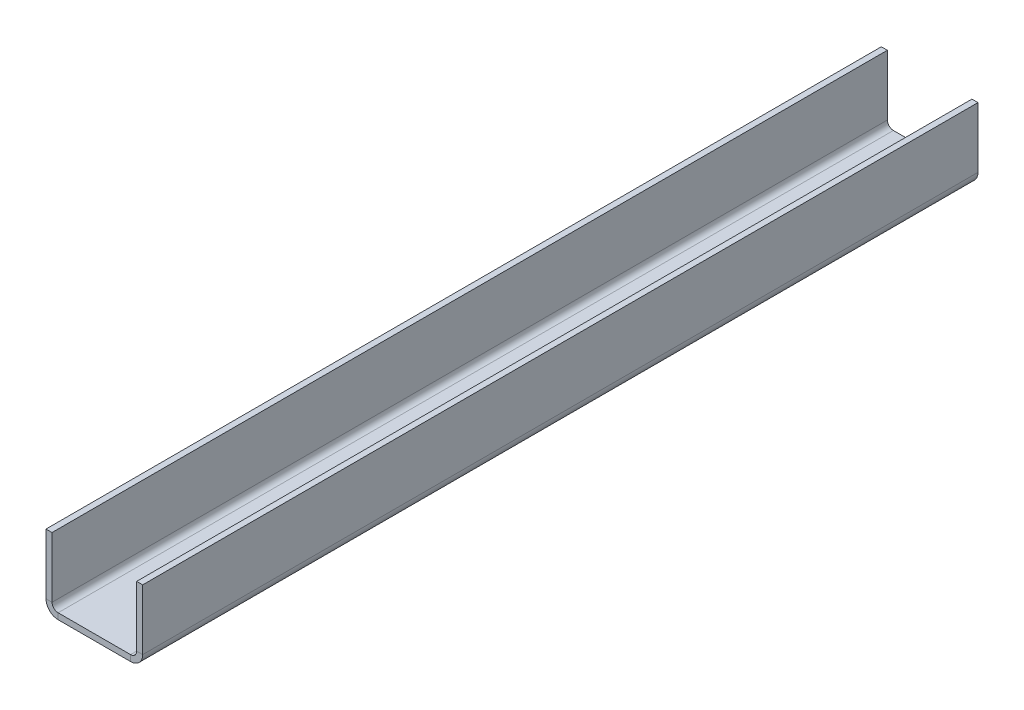
ISO-10303-21;
HEADER;
FILE_DESCRIPTION(('STEP AP214'),'2;1');
FILE_NAME('part.step','',(''),(''),'','','');
FILE_SCHEMA(('AUTOMOTIVE_DESIGN { 1 0 10303 214 1 1 1 1 }'));
ENDSEC;
DATA;
#1=APPLICATION_CONTEXT('core data for automotive mechanical design processes');
#2=APPLICATION_PROTOCOL_DEFINITION('international standard','automotive_design',2000,#1);
#3=PRODUCT_CONTEXT('',#1,'mechanical');
#4=PRODUCT('Part','Part','',(#3));
#5=PRODUCT_RELATED_PRODUCT_CATEGORY('part','',(#4));
#6=PRODUCT_DEFINITION_FORMATION('','',#4);
#7=PRODUCT_DEFINITION_CONTEXT('part definition',#1,'design');
#8=PRODUCT_DEFINITION('design','',#6,#7);
#9=PRODUCT_DEFINITION_SHAPE('','',#8);
#10=(LENGTH_UNIT() NAMED_UNIT(*) SI_UNIT(.MILLI.,.METRE.));
#11=(NAMED_UNIT(*) PLANE_ANGLE_UNIT() SI_UNIT($,.RADIAN.));
#12=(NAMED_UNIT(*) SI_UNIT($,.STERADIAN.) SOLID_ANGLE_UNIT());
#13=UNCERTAINTY_MEASURE_WITH_UNIT(LENGTH_MEASURE(1.E-05),#10,'distance_accuracy_value','');
#14=(GEOMETRIC_REPRESENTATION_CONTEXT(3) GLOBAL_UNCERTAINTY_ASSIGNED_CONTEXT((#13)) GLOBAL_UNIT_ASSIGNED_CONTEXT((#10,
#11,#12)) REPRESENTATION_CONTEXT('',''));
#15=CARTESIAN_POINT('',(0.,0.,0.));
#16=DIRECTION('',(0.,0.,1.));
#17=DIRECTION('',(1.,0.,0.));
#18=AXIS2_PLACEMENT_3D('',#15,#16,#17);
#19=CARTESIAN_POINT('',(0.,6.35,438.912));
#20=DIRECTION('',(0.,0.,1.));
#21=DIRECTION('',(1.,0.,0.));
#22=AXIS2_PLACEMENT_3D('',#19,#20,#21);
#23=PLANE('',#22);
#24=DIRECTION('',(1.,0.,0.));
#25=VECTOR('',#24,1.);
#26=CARTESIAN_POINT('',(0.,6.35,438.912));
#27=LINE('',#26,#25);
#28=CARTESIAN_POINT('',(0.,6.35,438.912));
#29=VERTEX_POINT('',#28);
#30=CARTESIAN_POINT('',(3.175,6.35,438.912));
#31=VERTEX_POINT('',#30);
#32=EDGE_CURVE('E11',#29,#31,#27,.T.);
#33=ORIENTED_EDGE('',*,*,#32,.F.);
#34=CARTESIAN_POINT('',(6.35,6.35,438.912));
#35=DIRECTION('',(0.,0.,-1.));
#36=DIRECTION('',(-1.,0.,0.));
#37=AXIS2_PLACEMENT_3D('',#34,#35,#36);
#38=CIRCLE('',#37,6.35);
#39=CARTESIAN_POINT('',(6.35,0.,438.912));
#40=VERTEX_POINT('',#39);
#41=EDGE_CURVE('E147',#29,#40,#38,.F.);
#42=ORIENTED_EDGE('',*,*,#41,.T.);
#43=DIRECTION('',(0.,-1.,0.));
#44=VECTOR('',#43,1.);
#45=CARTESIAN_POINT('',(6.35,3.175,438.912));
#46=LINE('',#45,#44);
#47=CARTESIAN_POINT('',(6.35,3.175,438.912));
#48=VERTEX_POINT('',#47);
#49=EDGE_CURVE('E45',#48,#40,#46,.T.);
#50=ORIENTED_EDGE('',*,*,#49,.F.);
#51=CARTESIAN_POINT('',(6.35,6.35,438.912));
#52=DIRECTION('',(0.,0.,1.));
#53=DIRECTION('',(1.,0.,0.));
#54=AXIS2_PLACEMENT_3D('',#51,#52,#53);
#55=CIRCLE('',#54,3.175);
#56=EDGE_CURVE('E241',#31,#48,#55,.T.);
#57=ORIENTED_EDGE('',*,*,#56,.F.);
#58=EDGE_LOOP('',(#33,#42,#50,#57));
#59=FACE_BOUND('',#58,.T.);
#60=ADVANCED_FACE('F37',(#59),#23,.T.);
#61=CARTESIAN_POINT('',(6.35,3.175,438.912));
#62=DIRECTION('',(0.,0.,1.));
#63=DIRECTION('',(1.,0.,0.));
#64=AXIS2_PLACEMENT_3D('',#61,#62,#63);
#65=PLANE('',#64);
#66=DIRECTION('',(0.,-1.,0.));
#67=VECTOR('',#66,1.);
#68=CARTESIAN_POINT('',(0.,0.,438.912));
#69=LINE('',#68,#67);
#70=CARTESIAN_POINT('',(0.,38.1,438.912));
#71=VERTEX_POINT('',#70);
#72=EDGE_CURVE('E152',#71,#29,#69,.T.);
#73=ORIENTED_EDGE('',*,*,#72,.T.);
#74=ORIENTED_EDGE('',*,*,#32,.T.);
#75=DIRECTION('',(0.,1.,0.));
#76=VECTOR('',#75,1.);
#77=CARTESIAN_POINT('',(3.175,0.,438.912));
#78=LINE('',#77,#76);
#79=CARTESIAN_POINT('',(3.175,38.1,438.912));
#80=VERTEX_POINT('',#79);
#81=EDGE_CURVE('E254',#80,#31,#78,.F.);
#82=ORIENTED_EDGE('',*,*,#81,.F.);
#83=DIRECTION('',(1.,0.,0.));
#84=VECTOR('',#83,1.);
#85=CARTESIAN_POINT('',(0.,38.1,438.912));
#86=LINE('',#85,#84);
#87=EDGE_CURVE('E256',#71,#80,#86,.T.);
#88=ORIENTED_EDGE('',*,*,#87,.F.);
#89=EDGE_LOOP('',(#73,#74,#82,#88));
#90=FACE_BOUND('',#89,.T.);
#91=ADVANCED_FACE('F267',(#90),#65,.T.);
#92=CARTESIAN_POINT('',(6.35,0.,0.));
#93=DIRECTION('',(0.,0.,-1.));
#94=DIRECTION('',(-1.,0.,0.));
#95=AXIS2_PLACEMENT_3D('',#92,#93,#94);
#96=PLANE('',#95);
#97=DIRECTION('',(0.,1.,0.));
#98=VECTOR('',#97,1.);
#99=CARTESIAN_POINT('',(6.35,0.,0.));
#100=LINE('',#99,#98);
#101=CARTESIAN_POINT('',(6.35,0.,0.));
#102=VERTEX_POINT('',#101);
#103=CARTESIAN_POINT('',(6.35,3.175,0.));
#104=VERTEX_POINT('',#103);
#105=EDGE_CURVE('E145',#102,#104,#100,.T.);
#106=ORIENTED_EDGE('',*,*,#105,.F.);
#107=CARTESIAN_POINT('',(6.35,6.35,0.));
#108=DIRECTION('',(0.,0.,-1.));
#109=DIRECTION('',(-1.,0.,0.));
#110=AXIS2_PLACEMENT_3D('',#107,#108,#109);
#111=CIRCLE('',#110,6.35);
#112=CARTESIAN_POINT('',(0.,6.35,0.));
#113=VERTEX_POINT('',#112);
#114=EDGE_CURVE('E159',#113,#102,#111,.F.);
#115=ORIENTED_EDGE('',*,*,#114,.F.);
#116=DIRECTION('',(-1.,0.,0.));
#117=VECTOR('',#116,1.);
#118=CARTESIAN_POINT('',(3.175,6.35,0.));
#119=LINE('',#118,#117);
#120=CARTESIAN_POINT('',(3.175,6.35,0.));
#121=VERTEX_POINT('',#120);
#122=EDGE_CURVE('E232',#121,#113,#119,.T.);
#123=ORIENTED_EDGE('',*,*,#122,.F.);
#124=CARTESIAN_POINT('',(6.35,6.35,0.));
#125=DIRECTION('',(0.,0.,1.));
#126=DIRECTION('',(1.,0.,0.));
#127=AXIS2_PLACEMENT_3D('',#124,#125,#126);
#128=CIRCLE('',#127,3.175);
#129=EDGE_CURVE('E186',#121,#104,#128,.T.);
#130=ORIENTED_EDGE('',*,*,#129,.T.);
#131=EDGE_LOOP('',(#106,#115,#123,#130));
#132=FACE_BOUND('',#131,.T.);
#133=ADVANCED_FACE('F246',(#132),#96,.T.);
#134=CARTESIAN_POINT('',(3.175,6.35,0.));
#135=DIRECTION('',(0.,0.,-1.));
#136=DIRECTION('',(-1.,0.,0.));
#137=AXIS2_PLACEMENT_3D('',#134,#135,#136);
#138=PLANE('',#137);
#139=DIRECTION('',(1.,0.,0.));
#140=VECTOR('',#139,1.);
#141=CARTESIAN_POINT('',(0.,0.,0.));
#142=LINE('',#141,#140);
#143=CARTESIAN_POINT('',(44.45,0.,0.));
#144=VERTEX_POINT('',#143);
#145=EDGE_CURVE('E199',#102,#144,#142,.T.);
#146=ORIENTED_EDGE('',*,*,#145,.F.);
#147=ORIENTED_EDGE('',*,*,#105,.T.);
#148=DIRECTION('',(1.,0.,0.));
#149=VECTOR('',#148,1.);
#150=CARTESIAN_POINT('',(0.,3.175,0.));
#151=LINE('',#150,#149);
#152=CARTESIAN_POINT('',(44.45,3.175,0.));
#153=VERTEX_POINT('',#152);
#154=EDGE_CURVE('E184',#104,#153,#151,.T.);
#155=ORIENTED_EDGE('',*,*,#154,.T.);
#156=DIRECTION('',(0.,-1.,0.));
#157=VECTOR('',#156,1.);
#158=CARTESIAN_POINT('',(44.45,3.175,0.));
#159=LINE('',#158,#157);
#160=EDGE_CURVE('E94',#153,#144,#159,.T.);
#161=ORIENTED_EDGE('',*,*,#160,.T.);
#162=EDGE_LOOP('',(#146,#147,#155,#161));
#163=FACE_BOUND('',#162,.T.);
#164=ADVANCED_FACE('F234',(#163),#138,.T.);
#165=CARTESIAN_POINT('',(44.45,0.,438.912));
#166=DIRECTION('',(0.,0.,1.));
#167=DIRECTION('',(1.,0.,0.));
#168=AXIS2_PLACEMENT_3D('',#165,#166,#167);
#169=PLANE('',#168);
#170=DIRECTION('',(0.,1.,0.));
#171=VECTOR('',#170,1.);
#172=CARTESIAN_POINT('',(44.45,0.,438.912));
#173=LINE('',#172,#171);
#174=CARTESIAN_POINT('',(44.45,0.,438.912));
#175=VERTEX_POINT('',#174);
#176=CARTESIAN_POINT('',(44.45,3.175,438.912));
#177=VERTEX_POINT('',#176);
#178=EDGE_CURVE('E230',#175,#177,#173,.T.);
#179=ORIENTED_EDGE('',*,*,#178,.F.);
#180=CARTESIAN_POINT('',(44.45,6.35,438.912));
#181=DIRECTION('',(0.,0.,-1.));
#182=DIRECTION('',(-1.,0.,0.));
#183=AXIS2_PLACEMENT_3D('',#180,#181,#182);
#184=CIRCLE('',#183,6.35);
#185=CARTESIAN_POINT('',(50.8,6.35,438.912));
#186=VERTEX_POINT('',#185);
#187=EDGE_CURVE('E167',#175,#186,#184,.F.);
#188=ORIENTED_EDGE('',*,*,#187,.T.);
#189=DIRECTION('',(1.,0.,0.));
#190=VECTOR('',#189,1.);
#191=CARTESIAN_POINT('',(47.625,6.35,438.912));
#192=LINE('',#191,#190);
#193=CARTESIAN_POINT('',(47.625,6.35,438.912));
#194=VERTEX_POINT('',#193);
#195=EDGE_CURVE('E53',#194,#186,#192,.T.);
#196=ORIENTED_EDGE('',*,*,#195,.F.);
#197=CARTESIAN_POINT('',(44.45,6.35,438.912));
#198=DIRECTION('',(0.,0.,1.));
#199=DIRECTION('',(1.,0.,0.));
#200=AXIS2_PLACEMENT_3D('',#197,#198,#199);
#201=CIRCLE('',#200,3.175);
#202=EDGE_CURVE('E258',#177,#194,#201,.T.);
#203=ORIENTED_EDGE('',*,*,#202,.F.);
#204=EDGE_LOOP('',(#179,#188,#196,#203));
#205=FACE_BOUND('',#204,.T.);
#206=ADVANCED_FACE('F293',(#205),#169,.T.);
#207=CARTESIAN_POINT('',(47.625,6.35,438.912));
#208=DIRECTION('',(0.,0.,1.));
#209=DIRECTION('',(1.,0.,0.));
#210=AXIS2_PLACEMENT_3D('',#207,#208,#209);
#211=PLANE('',#210);
#212=DIRECTION('',(1.,0.,0.));
#213=VECTOR('',#212,1.);
#214=CARTESIAN_POINT('',(0.,0.,438.912));
#215=LINE('',#214,#213);
#216=EDGE_CURVE('E137',#40,#175,#215,.T.);
#217=ORIENTED_EDGE('',*,*,#216,.T.);
#218=ORIENTED_EDGE('',*,*,#178,.T.);
#219=DIRECTION('',(1.,0.,0.));
#220=VECTOR('',#219,1.);
#221=CARTESIAN_POINT('',(0.,3.175,438.912));
#222=LINE('',#221,#220);
#223=EDGE_CURVE('E140',#48,#177,#222,.T.);
#224=ORIENTED_EDGE('',*,*,#223,.F.);
#225=ORIENTED_EDGE('',*,*,#49,.T.);
#226=EDGE_LOOP('',(#217,#218,#224,#225));
#227=FACE_BOUND('',#226,.T.);
#228=ADVANCED_FACE('F135',(#227),#211,.T.);
#229=CARTESIAN_POINT('',(50.8,6.35,0.));
#230=DIRECTION('',(0.,0.,-1.));
#231=DIRECTION('',(-1.,0.,0.));
#232=AXIS2_PLACEMENT_3D('',#229,#230,#231);
#233=PLANE('',#232);
#234=DIRECTION('',(-1.,0.,0.));
#235=VECTOR('',#234,1.);
#236=CARTESIAN_POINT('',(50.8,6.35,0.));
#237=LINE('',#236,#235);
#238=CARTESIAN_POINT('',(50.8,6.35,0.));
#239=VERTEX_POINT('',#238);
#240=CARTESIAN_POINT('',(47.625,6.35,0.));
#241=VERTEX_POINT('',#240);
#242=EDGE_CURVE('E101',#239,#241,#237,.T.);
#243=ORIENTED_EDGE('',*,*,#242,.F.);
#244=CARTESIAN_POINT('',(44.45,6.35,0.));
#245=DIRECTION('',(0.,0.,-1.));
#246=DIRECTION('',(-1.,0.,0.));
#247=AXIS2_PLACEMENT_3D('',#244,#245,#246);
#248=CIRCLE('',#247,6.35);
#249=EDGE_CURVE('E201',#144,#239,#248,.F.);
#250=ORIENTED_EDGE('',*,*,#249,.F.);
#251=ORIENTED_EDGE('',*,*,#160,.F.);
#252=CARTESIAN_POINT('',(44.45,6.35,0.));
#253=DIRECTION('',(0.,0.,1.));
#254=DIRECTION('',(1.,0.,0.));
#255=AXIS2_PLACEMENT_3D('',#252,#253,#254);
#256=CIRCLE('',#255,3.175);
#257=EDGE_CURVE('E182',#153,#241,#256,.T.);
#258=ORIENTED_EDGE('',*,*,#257,.T.);
#259=EDGE_LOOP('',(#243,#250,#251,#258));
#260=FACE_BOUND('',#259,.T.);
#261=ADVANCED_FACE('F299',(#260),#233,.T.);
#262=CARTESIAN_POINT('',(44.45,3.175,0.));
#263=DIRECTION('',(0.,0.,-1.));
#264=DIRECTION('',(-1.,0.,0.));
#265=AXIS2_PLACEMENT_3D('',#262,#263,#264);
#266=PLANE('',#265);
#267=DIRECTION('',(0.,1.,0.));
#268=VECTOR('',#267,1.);
#269=CARTESIAN_POINT('',(50.8,0.,0.));
#270=LINE('',#269,#268);
#271=CARTESIAN_POINT('',(50.8,38.1,0.));
#272=VERTEX_POINT('',#271);
#273=EDGE_CURVE('E173',#239,#272,#270,.T.);
#274=ORIENTED_EDGE('',*,*,#273,.F.);
#275=ORIENTED_EDGE('',*,*,#242,.T.);
#276=DIRECTION('',(0.,1.,0.));
#277=VECTOR('',#276,1.);
#278=CARTESIAN_POINT('',(47.625,0.,0.));
#279=LINE('',#278,#277);
#280=CARTESIAN_POINT('',(47.625,38.1,0.));
#281=VERTEX_POINT('',#280);
#282=EDGE_CURVE('E179',#241,#281,#279,.T.);
#283=ORIENTED_EDGE('',*,*,#282,.T.);
#284=DIRECTION('',(1.,0.,0.));
#285=VECTOR('',#284,1.);
#286=CARTESIAN_POINT('',(47.625,38.1,0.));
#287=LINE('',#286,#285);
#288=EDGE_CURVE('E176',#281,#272,#287,.T.);
#289=ORIENTED_EDGE('',*,*,#288,.T.);
#290=EDGE_LOOP('',(#274,#275,#283,#289));
#291=FACE_BOUND('',#290,.T.);
#292=ADVANCED_FACE('F302',(#291),#266,.T.);
#293=CARTESIAN_POINT('',(50.8,0.,438.912));
#294=DIRECTION('',(-1.,0.,0.));
#295=DIRECTION('',(0.,0.,1.));
#296=AXIS2_PLACEMENT_3D('',#293,#294,#295);
#297=PLANE('',#296);
#298=ORIENTED_EDGE('',*,*,#273,.T.);
#299=DIRECTION('',(0.,0.,-1.));
#300=VECTOR('',#299,1.);
#301=CARTESIAN_POINT('',(50.8,38.1,438.912));
#302=LINE('',#301,#300);
#303=CARTESIAN_POINT('',(50.8,38.1,438.912));
#304=VERTEX_POINT('',#303);
#305=EDGE_CURVE('E225',#304,#272,#302,.T.);
#306=ORIENTED_EDGE('',*,*,#305,.F.);
#307=DIRECTION('',(0.,1.,0.));
#308=VECTOR('',#307,1.);
#309=CARTESIAN_POINT('',(50.8,0.,438.912));
#310=LINE('',#309,#308);
#311=EDGE_CURVE('E107',#186,#304,#310,.T.);
#312=ORIENTED_EDGE('',*,*,#311,.F.);
#313=DIRECTION('',(0.,0.,-1.));
#314=VECTOR('',#313,1.);
#315=CARTESIAN_POINT('',(50.8,6.35,438.912));
#316=LINE('',#315,#314);
#317=EDGE_CURVE('E169',#186,#239,#316,.T.);
#318=ORIENTED_EDGE('',*,*,#317,.T.);
#319=EDGE_LOOP('',(#298,#306,#312,#318));
#320=FACE_BOUND('',#319,.T.);
#321=ADVANCED_FACE('F305',(#320),#297,.F.);
#322=CARTESIAN_POINT('',(47.625,38.1,438.912));
#323=DIRECTION('',(0.,1.,0.));
#324=DIRECTION('',(0.,0.,1.));
#325=AXIS2_PLACEMENT_3D('',#322,#323,#324);
#326=PLANE('',#325);
#327=ORIENTED_EDGE('',*,*,#288,.F.);
#328=DIRECTION('',(0.,0.,-1.));
#329=VECTOR('',#328,1.);
#330=CARTESIAN_POINT('',(47.625,38.1,438.912));
#331=LINE('',#330,#329);
#332=CARTESIAN_POINT('',(47.625,38.1,438.912));
#333=VERTEX_POINT('',#332);
#334=EDGE_CURVE('E223',#333,#281,#331,.T.);
#335=ORIENTED_EDGE('',*,*,#334,.F.);
#336=DIRECTION('',(1.,0.,0.));
#337=VECTOR('',#336,1.);
#338=CARTESIAN_POINT('',(47.625,38.1,438.912));
#339=LINE('',#338,#337);
#340=EDGE_CURVE('E513',#333,#304,#339,.T.);
#341=ORIENTED_EDGE('',*,*,#340,.T.);
#342=ORIENTED_EDGE('',*,*,#305,.T.);
#343=EDGE_LOOP('',(#327,#335,#341,#342));
#344=FACE_BOUND('',#343,.T.);
#345=ADVANCED_FACE('F309',(#344),#326,.T.);
#346=CARTESIAN_POINT('',(47.625,0.,438.912));
#347=DIRECTION('',(-1.,0.,0.));
#348=DIRECTION('',(0.,0.,1.));
#349=AXIS2_PLACEMENT_3D('',#346,#347,#348);
#350=PLANE('',#349);
#351=ORIENTED_EDGE('',*,*,#282,.F.);
#352=DIRECTION('',(0.,0.,-1.));
#353=VECTOR('',#352,1.);
#354=CARTESIAN_POINT('',(47.625,6.35,438.912));
#355=LINE('',#354,#353);
#356=EDGE_CURVE('E220',#194,#241,#355,.T.);
#357=ORIENTED_EDGE('',*,*,#356,.F.);
#358=DIRECTION('',(0.,1.,0.));
#359=VECTOR('',#358,1.);
#360=CARTESIAN_POINT('',(47.625,0.,438.912));
#361=LINE('',#360,#359);
#362=EDGE_CURVE('E515',#194,#333,#361,.T.);
#363=ORIENTED_EDGE('',*,*,#362,.T.);
#364=ORIENTED_EDGE('',*,*,#334,.T.);
#365=EDGE_LOOP('',(#351,#357,#363,#364));
#366=FACE_BOUND('',#365,.T.);
#367=ADVANCED_FACE('F313',(#366),#350,.T.);
#368=CARTESIAN_POINT('',(44.45,6.35,438.912));
#369=DIRECTION('',(0.,0.,-1.));
#370=DIRECTION('',(-1.,0.,0.));
#371=AXIS2_PLACEMENT_3D('',#368,#369,#370);
#372=CYLINDRICAL_SURFACE('',#371,3.175);
#373=ORIENTED_EDGE('',*,*,#257,.F.);
#374=DIRECTION('',(0.,0.,-1.));
#375=VECTOR('',#374,1.);
#376=CARTESIAN_POINT('',(44.45,3.175,438.912));
#377=LINE('',#376,#375);
#378=EDGE_CURVE('E217',#177,#153,#377,.T.);
#379=ORIENTED_EDGE('',*,*,#378,.F.);
#380=ORIENTED_EDGE('',*,*,#202,.T.);
#381=ORIENTED_EDGE('',*,*,#356,.T.);
#382=EDGE_LOOP('',(#373,#379,#380,#381));
#383=FACE_BOUND('',#382,.T.);
#384=ADVANCED_FACE('F317',(#383),#372,.F.);
#385=CARTESIAN_POINT('',(0.,3.175,438.912));
#386=DIRECTION('',(0.,1.,0.));
#387=DIRECTION('',(0.,0.,1.));
#388=AXIS2_PLACEMENT_3D('',#385,#386,#387);
#389=PLANE('',#388);
#390=ORIENTED_EDGE('',*,*,#154,.F.);
#391=DIRECTION('',(0.,0.,-1.));
#392=VECTOR('',#391,1.);
#393=CARTESIAN_POINT('',(6.35,3.175,438.912));
#394=LINE('',#393,#392);
#395=EDGE_CURVE('E214',#48,#104,#394,.T.);
#396=ORIENTED_EDGE('',*,*,#395,.F.);
#397=ORIENTED_EDGE('',*,*,#223,.T.);
#398=ORIENTED_EDGE('',*,*,#378,.T.);
#399=EDGE_LOOP('',(#390,#396,#397,#398));
#400=FACE_BOUND('',#399,.T.);
#401=ADVANCED_FACE('F243',(#400),#389,.T.);
#402=CARTESIAN_POINT('',(6.35,6.35,438.912));
#403=DIRECTION('',(0.,0.,-1.));
#404=DIRECTION('',(-1.,0.,0.));
#405=AXIS2_PLACEMENT_3D('',#402,#403,#404);
#406=CYLINDRICAL_SURFACE('',#405,3.175);
#407=ORIENTED_EDGE('',*,*,#129,.F.);
#408=DIRECTION('',(0.,0.,-1.));
#409=VECTOR('',#408,1.);
#410=CARTESIAN_POINT('',(3.175,6.35,438.912));
#411=LINE('',#410,#409);
#412=EDGE_CURVE('E211',#31,#121,#411,.T.);
#413=ORIENTED_EDGE('',*,*,#412,.F.);
#414=ORIENTED_EDGE('',*,*,#56,.T.);
#415=ORIENTED_EDGE('',*,*,#395,.T.);
#416=EDGE_LOOP('',(#407,#413,#414,#415));
#417=FACE_BOUND('',#416,.T.);
#418=ADVANCED_FACE('F239',(#417),#406,.F.);
#419=CARTESIAN_POINT('',(3.175,0.,438.912));
#420=DIRECTION('',(1.,0.,0.));
#421=DIRECTION('',(0.,0.,-1.));
#422=AXIS2_PLACEMENT_3D('',#419,#420,#421);
#423=PLANE('',#422);
#424=DIRECTION('',(0.,1.,0.));
#425=VECTOR('',#424,1.);
#426=CARTESIAN_POINT('',(3.175,0.,0.));
#427=LINE('',#426,#425);
#428=CARTESIAN_POINT('',(3.175,38.1,0.));
#429=VERTEX_POINT('',#428);
#430=EDGE_CURVE('E189',#429,#121,#427,.F.);
#431=ORIENTED_EDGE('',*,*,#430,.F.);
#432=DIRECTION('',(0.,0.,-1.));
#433=VECTOR('',#432,1.);
#434=CARTESIAN_POINT('',(3.175,38.1,438.912));
#435=LINE('',#434,#433);
#436=EDGE_CURVE('E209',#80,#429,#435,.T.);
#437=ORIENTED_EDGE('',*,*,#436,.F.);
#438=ORIENTED_EDGE('',*,*,#81,.T.);
#439=ORIENTED_EDGE('',*,*,#412,.T.);
#440=EDGE_LOOP('',(#431,#437,#438,#439));
#441=FACE_BOUND('',#440,.T.);
#442=ADVANCED_FACE('F252',(#441),#423,.T.);
#443=CARTESIAN_POINT('',(0.,38.1,438.912));
#444=DIRECTION('',(0.,1.,0.));
#445=DIRECTION('',(0.,0.,1.));
#446=AXIS2_PLACEMENT_3D('',#443,#444,#445);
#447=PLANE('',#446);
#448=DIRECTION('',(1.,0.,0.));
#449=VECTOR('',#448,1.);
#450=CARTESIAN_POINT('',(0.,38.1,0.));
#451=LINE('',#450,#449);
#452=CARTESIAN_POINT('',(0.,38.1,0.));
#453=VERTEX_POINT('',#452);
#454=EDGE_CURVE('E192',#453,#429,#451,.T.);
#455=ORIENTED_EDGE('',*,*,#454,.F.);
#456=DIRECTION('',(0.,0.,-1.));
#457=VECTOR('',#456,1.);
#458=CARTESIAN_POINT('',(0.,38.1,438.912));
#459=LINE('',#458,#457);
#460=EDGE_CURVE('E207',#71,#453,#459,.T.);
#461=ORIENTED_EDGE('',*,*,#460,.F.);
#462=ORIENTED_EDGE('',*,*,#87,.T.);
#463=ORIENTED_EDGE('',*,*,#436,.T.);
#464=EDGE_LOOP('',(#455,#461,#462,#463));
#465=FACE_BOUND('',#464,.T.);
#466=ADVANCED_FACE('F273',(#465),#447,.T.);
#467=CARTESIAN_POINT('',(0.,0.,438.912));
#468=DIRECTION('',(1.,0.,0.));
#469=DIRECTION('',(0.,0.,-1.));
#470=AXIS2_PLACEMENT_3D('',#467,#468,#469);
#471=PLANE('',#470);
#472=DIRECTION('',(0.,-1.,0.));
#473=VECTOR('',#472,1.);
#474=CARTESIAN_POINT('',(0.,0.,0.));
#475=LINE('',#474,#473);
#476=EDGE_CURVE('E195',#453,#113,#475,.T.);
#477=ORIENTED_EDGE('',*,*,#476,.T.);
#478=DIRECTION('',(0.,0.,-1.));
#479=VECTOR('',#478,1.);
#480=CARTESIAN_POINT('',(0.,6.35,438.912));
#481=LINE('',#480,#479);
#482=EDGE_CURVE('E161',#29,#113,#481,.T.);
#483=ORIENTED_EDGE('',*,*,#482,.F.);
#484=ORIENTED_EDGE('',*,*,#72,.F.);
#485=ORIENTED_EDGE('',*,*,#460,.T.);
#486=EDGE_LOOP('',(#477,#483,#484,#485));
#487=FACE_BOUND('',#486,.T.);
#488=ADVANCED_FACE('F269',(#487),#471,.F.);
#489=CARTESIAN_POINT('',(6.35,6.35,438.912));
#490=DIRECTION('',(0.,0.,-1.));
#491=DIRECTION('',(-1.,0.,0.));
#492=AXIS2_PLACEMENT_3D('',#489,#490,#491);
#493=CYLINDRICAL_SURFACE('',#492,6.35);
#494=ORIENTED_EDGE('',*,*,#114,.T.);
#495=DIRECTION('',(0.,0.,-1.));
#496=VECTOR('',#495,1.);
#497=CARTESIAN_POINT('',(6.35,0.,438.912));
#498=LINE('',#497,#496);
#499=EDGE_CURVE('E156',#40,#102,#498,.T.);
#500=ORIENTED_EDGE('',*,*,#499,.F.);
#501=ORIENTED_EDGE('',*,*,#41,.F.);
#502=ORIENTED_EDGE('',*,*,#482,.T.);
#503=EDGE_LOOP('',(#494,#500,#501,#502));
#504=FACE_BOUND('',#503,.T.);
#505=ADVANCED_FACE('F157',(#504),#493,.T.);
#506=CARTESIAN_POINT('',(0.,0.,438.912));
#507=DIRECTION('',(0.,1.,0.));
#508=DIRECTION('',(0.,0.,1.));
#509=AXIS2_PLACEMENT_3D('',#506,#507,#508);
#510=PLANE('',#509);
#511=ORIENTED_EDGE('',*,*,#145,.T.);
#512=DIRECTION('',(0.,0.,-1.));
#513=VECTOR('',#512,1.);
#514=CARTESIAN_POINT('',(44.45,0.,438.912));
#515=LINE('',#514,#513);
#516=EDGE_CURVE('E162',#175,#144,#515,.T.);
#517=ORIENTED_EDGE('',*,*,#516,.F.);
#518=ORIENTED_EDGE('',*,*,#216,.F.);
#519=ORIENTED_EDGE('',*,*,#499,.T.);
#520=EDGE_LOOP('',(#511,#517,#518,#519));
#521=FACE_BOUND('',#520,.T.);
#522=ADVANCED_FACE('F164',(#521),#510,.F.);
#523=CARTESIAN_POINT('',(44.45,6.35,438.912));
#524=DIRECTION('',(0.,0.,-1.));
#525=DIRECTION('',(-1.,0.,0.));
#526=AXIS2_PLACEMENT_3D('',#523,#524,#525);
#527=CYLINDRICAL_SURFACE('',#526,6.35);
#528=ORIENTED_EDGE('',*,*,#249,.T.);
#529=ORIENTED_EDGE('',*,*,#317,.F.);
#530=ORIENTED_EDGE('',*,*,#187,.F.);
#531=ORIENTED_EDGE('',*,*,#516,.T.);
#532=EDGE_LOOP('',(#528,#529,#530,#531));
#533=FACE_BOUND('',#532,.T.);
#534=ADVANCED_FACE('F364',(#533),#527,.T.);
#535=CARTESIAN_POINT('',(44.45,6.35,438.912));
#536=DIRECTION('',(0.,0.,1.));
#537=DIRECTION('',(1.,0.,0.));
#538=AXIS2_PLACEMENT_3D('',#535,#536,#537);
#539=PLANE('',#538);
#540=ORIENTED_EDGE('',*,*,#311,.T.);
#541=ORIENTED_EDGE('',*,*,#340,.F.);
#542=ORIENTED_EDGE('',*,*,#362,.F.);
#543=ORIENTED_EDGE('',*,*,#195,.T.);
#544=EDGE_LOOP('',(#540,#541,#542,#543));
#545=FACE_BOUND('',#544,.T.);
#546=ADVANCED_FACE('F374',(#545),#539,.T.);
#547=CARTESIAN_POINT('',(44.45,6.35,0.));
#548=DIRECTION('',(0.,0.,1.));
#549=DIRECTION('',(1.,0.,0.));
#550=AXIS2_PLACEMENT_3D('',#547,#548,#549);
#551=PLANE('',#550);
#552=ORIENTED_EDGE('',*,*,#430,.T.);
#553=ORIENTED_EDGE('',*,*,#122,.T.);
#554=ORIENTED_EDGE('',*,*,#476,.F.);
#555=ORIENTED_EDGE('',*,*,#454,.T.);
#556=EDGE_LOOP('',(#552,#553,#554,#555));
#557=FACE_BOUND('',#556,.T.);
#558=ADVANCED_FACE('F271',(#557),#551,.F.);
#559=CLOSED_SHELL('',(#60,#91,#133,#164,#206,#228,#261,#292,#321,#345,#367,#384,#401,#418,#442,
#466,#488,#505,#522,#534,#546,#558));
#560=MANIFOLD_SOLID_BREP('B2',#559);
#561=ADVANCED_BREP_SHAPE_REPRESENTATION('',(#18,#560),#14);
#562=SHAPE_DEFINITION_REPRESENTATION(#9,#561);
ENDSEC;
END-ISO-10303-21;
